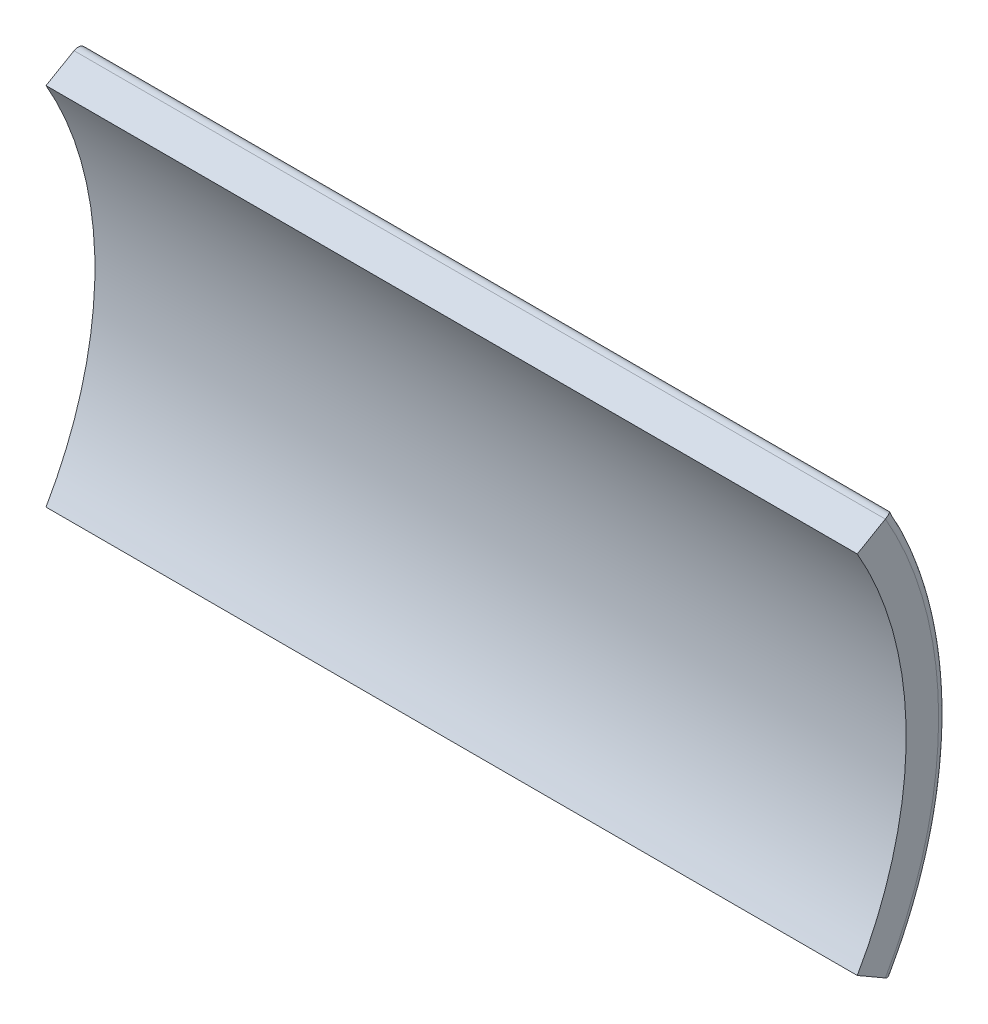
ISO-10303-21;
HEADER;
FILE_DESCRIPTION(('STEP AP214'),'2;1');
FILE_NAME('part.step','',(''),(''),'','','');
FILE_SCHEMA(('AUTOMOTIVE_DESIGN { 1 0 10303 214 1 1 1 1 }'));
ENDSEC;
DATA;
#1=APPLICATION_CONTEXT('core data for automotive mechanical design processes');
#2=APPLICATION_PROTOCOL_DEFINITION('international standard','automotive_design',2000,#1);
#3=PRODUCT_CONTEXT('',#1,'mechanical');
#4=PRODUCT('Part','Part','',(#3));
#5=PRODUCT_RELATED_PRODUCT_CATEGORY('part','',(#4));
#6=PRODUCT_DEFINITION_FORMATION('','',#4);
#7=PRODUCT_DEFINITION_CONTEXT('part definition',#1,'design');
#8=PRODUCT_DEFINITION('design','',#6,#7);
#9=PRODUCT_DEFINITION_SHAPE('','',#8);
#10=(LENGTH_UNIT() NAMED_UNIT(*) SI_UNIT(.MILLI.,.METRE.));
#11=(NAMED_UNIT(*) PLANE_ANGLE_UNIT() SI_UNIT($,.RADIAN.));
#12=(NAMED_UNIT(*) SI_UNIT($,.STERADIAN.) SOLID_ANGLE_UNIT());
#13=UNCERTAINTY_MEASURE_WITH_UNIT(LENGTH_MEASURE(1.E-05),#10,'distance_accuracy_value','');
#14=(GEOMETRIC_REPRESENTATION_CONTEXT(3) GLOBAL_UNCERTAINTY_ASSIGNED_CONTEXT((#13)) GLOBAL_UNIT_ASSIGNED_CONTEXT((#10,
#11,#12)) REPRESENTATION_CONTEXT('',''));
#15=CARTESIAN_POINT('',(0.,0.,0.));
#16=DIRECTION('',(0.,0.,1.));
#17=DIRECTION('',(1.,0.,0.));
#18=AXIS2_PLACEMENT_3D('',#15,#16,#17);
#19=CARTESIAN_POINT('',(10.,0.,0.));
#20=DIRECTION('',(-1.,0.,0.));
#21=DIRECTION('',(0.,0.,1.));
#22=AXIS2_PLACEMENT_3D('',#19,#20,#21);
#23=CYLINDRICAL_SURFACE('',#22,4.5);
#24=CARTESIAN_POINT('',(0.,0.,0.));
#25=DIRECTION('',(-1.,0.,0.));
#26=DIRECTION('',(0.,0.,1.));
#27=AXIS2_PLACEMENT_3D('',#24,#25,#26);
#28=CIRCLE('',#27,4.5);
#29=CARTESIAN_POINT('',(0.,2.25,-3.89711431702997));
#30=VERTEX_POINT('',#29);
#31=CARTESIAN_POINT('',(0.,-2.25,-3.89711431702997));
#32=VERTEX_POINT('',#31);
#33=EDGE_CURVE('E117',#30,#32,#28,.T.);
#34=ORIENTED_EDGE('',*,*,#33,.T.);
#35=DIRECTION('',(-1.,0.,0.));
#36=VECTOR('',#35,1.);
#37=CARTESIAN_POINT('',(10.,-2.25,-3.89711431702997));
#38=LINE('',#37,#36);
#39=CARTESIAN_POINT('',(10.,-2.25,-3.89711431702997));
#40=VERTEX_POINT('',#39);
#41=EDGE_CURVE('E102',#40,#32,#38,.T.);
#42=ORIENTED_EDGE('',*,*,#41,.F.);
#43=CARTESIAN_POINT('',(10.,0.,0.));
#44=DIRECTION('',(-1.,0.,0.));
#45=DIRECTION('',(0.,0.,1.));
#46=AXIS2_PLACEMENT_3D('',#43,#44,#45);
#47=CIRCLE('',#46,4.5);
#48=CARTESIAN_POINT('',(10.,2.25,-3.89711431702997));
#49=VERTEX_POINT('',#48);
#50=EDGE_CURVE('E110',#49,#40,#47,.T.);
#51=ORIENTED_EDGE('',*,*,#50,.F.);
#52=DIRECTION('',(-1.,0.,0.));
#53=VECTOR('',#52,1.);
#54=CARTESIAN_POINT('',(10.,2.25,-3.89711431702997));
#55=LINE('',#54,#53);
#56=EDGE_CURVE('E119',#49,#30,#55,.T.);
#57=ORIENTED_EDGE('',*,*,#56,.T.);
#58=EDGE_LOOP('',(#34,#42,#51,#57));
#59=FACE_BOUND('',#58,.T.);
#60=ADVANCED_FACE('F33',(#59),#23,.F.);
#61=CARTESIAN_POINT('',(10.,-2.5,-4.33012701892219));
#62=DIRECTION('',(0.,0.86602540378444,-0.499999999999997));
#63=DIRECTION('',(0.,0.499999999999997,0.86602540378444));
#64=AXIS2_PLACEMENT_3D('',#61,#62,#63);
#65=PLANE('',#64);
#66=DIRECTION('',(0.,-0.499999999999997,-0.86602540378444));
#67=VECTOR('',#66,1.);
#68=CARTESIAN_POINT('',(0.,-2.5,-4.33012701892219));
#69=LINE('',#68,#67);
#70=CARTESIAN_POINT('',(0.,-2.44948974278318,-4.24264068711929));
#71=VERTEX_POINT('',#70);
#72=EDGE_CURVE('E231',#32,#71,#69,.T.);
#73=ORIENTED_EDGE('',*,*,#72,.T.);
#74=DIRECTION('',(-1.,0.,0.));
#75=VECTOR('',#74,1.);
#76=CARTESIAN_POINT('',(10.,-2.44948974278318,-4.24264068711929));
#77=LINE('',#76,#75);
#78=CARTESIAN_POINT('',(10.,-2.44948974278318,-4.24264068711929));
#79=VERTEX_POINT('',#78);
#80=EDGE_CURVE('E105',#71,#79,#77,.F.);
#81=ORIENTED_EDGE('',*,*,#80,.T.);
#82=DIRECTION('',(0.,-0.499999999999997,-0.86602540378444));
#83=VECTOR('',#82,1.);
#84=CARTESIAN_POINT('',(10.,-2.5,-4.33012701892219));
#85=LINE('',#84,#83);
#86=EDGE_CURVE('E97',#40,#79,#85,.T.);
#87=ORIENTED_EDGE('',*,*,#86,.F.);
#88=ORIENTED_EDGE('',*,*,#41,.T.);
#89=EDGE_LOOP('',(#73,#81,#87,#88));
#90=FACE_BOUND('',#89,.T.);
#91=ADVANCED_FACE('F100',(#90),#65,.F.);
#92=CARTESIAN_POINT('',(10.,0.,0.));
#93=DIRECTION('',(-1.,0.,0.));
#94=DIRECTION('',(0.,0.,1.));
#95=AXIS2_PLACEMENT_3D('',#92,#93,#94);
#96=CYLINDRICAL_SURFACE('',#95,5.);
#97=CARTESIAN_POINT('',(9.9,0.,0.));
#98=DIRECTION('',(-1.,0.,0.));
#99=DIRECTION('',(0.,0.,1.));
#100=AXIS2_PLACEMENT_3D('',#97,#98,#99);
#101=CIRCLE('',#100,5.);
#102=CARTESIAN_POINT('',(9.9,2.41110939020891,-4.38024559910131));
#103=VERTEX_POINT('',#102);
#104=CARTESIAN_POINT('',(9.9,-2.41110939020891,-4.38024559910131));
#105=VERTEX_POINT('',#104);
#106=EDGE_CURVE('E118',#103,#105,#101,.T.);
#107=ORIENTED_EDGE('',*,*,#106,.T.);
#108=DIRECTION('',(-1.,0.,0.));
#109=VECTOR('',#108,1.);
#110=CARTESIAN_POINT('',(10.,-2.41110939020891,-4.38024559910131));
#111=LINE('',#110,#109);
#112=CARTESIAN_POINT('',(0.,-2.41110939020891,-4.38024559910131));
#113=VERTEX_POINT('',#112);
#114=EDGE_CURVE('E128',#105,#113,#111,.T.);
#115=ORIENTED_EDGE('',*,*,#114,.T.);
#116=CARTESIAN_POINT('',(0.,0.,0.));
#117=DIRECTION('',(1.,0.,0.));
#118=DIRECTION('',(0.,0.,1.));
#119=AXIS2_PLACEMENT_3D('',#116,#117,#118);
#120=CIRCLE('',#119,5.);
#121=CARTESIAN_POINT('',(0.,2.41110939020891,-4.38024559910131));
#122=VERTEX_POINT('',#121);
#123=EDGE_CURVE('E230',#113,#122,#120,.T.);
#124=ORIENTED_EDGE('',*,*,#123,.T.);
#125=DIRECTION('',(-1.,0.,0.));
#126=VECTOR('',#125,1.);
#127=CARTESIAN_POINT('',(10.,2.41110939020891,-4.38024559910131));
#128=LINE('',#127,#126);
#129=EDGE_CURVE('E121',#122,#103,#128,.F.);
#130=ORIENTED_EDGE('',*,*,#129,.T.);
#131=EDGE_LOOP('',(#107,#115,#124,#130));
#132=FACE_BOUND('',#131,.T.);
#133=ADVANCED_FACE('F156',(#132),#96,.T.);
#134=CARTESIAN_POINT('',(10.,2.25,-3.89711431702997));
#135=DIRECTION('',(0.,-0.86602540378444,-0.499999999999997));
#136=DIRECTION('',(0.,0.499999999999997,-0.86602540378444));
#137=AXIS2_PLACEMENT_3D('',#134,#135,#136);
#138=PLANE('',#137);
#139=DIRECTION('',(0.,-0.499999999999997,0.86602540378444));
#140=VECTOR('',#139,1.);
#141=CARTESIAN_POINT('',(10.,2.25,-3.89711431702997));
#142=LINE('',#141,#140);
#143=CARTESIAN_POINT('',(10.,2.44948974278318,-4.24264068711929));
#144=VERTEX_POINT('',#143);
#145=EDGE_CURVE('E54',#144,#49,#142,.T.);
#146=ORIENTED_EDGE('',*,*,#145,.F.);
#147=DIRECTION('',(-1.,0.,0.));
#148=VECTOR('',#147,1.);
#149=CARTESIAN_POINT('',(10.,2.44948974278318,-4.24264068711929));
#150=LINE('',#149,#148);
#151=CARTESIAN_POINT('',(0.,2.44948974278318,-4.24264068711929));
#152=VERTEX_POINT('',#151);
#153=EDGE_CURVE('E11',#144,#152,#150,.T.);
#154=ORIENTED_EDGE('',*,*,#153,.T.);
#155=DIRECTION('',(0.,-0.499999999999997,0.86602540378444));
#156=VECTOR('',#155,1.);
#157=CARTESIAN_POINT('',(0.,2.25,-3.89711431702997));
#158=LINE('',#157,#156);
#159=EDGE_CURVE('E114',#152,#30,#158,.T.);
#160=ORIENTED_EDGE('',*,*,#159,.T.);
#161=ORIENTED_EDGE('',*,*,#56,.F.);
#162=EDGE_LOOP('',(#146,#154,#160,#161));
#163=FACE_BOUND('',#162,.T.);
#164=ADVANCED_FACE('F161',(#163),#138,.F.);
#165=CARTESIAN_POINT('',(10.,0.,0.));
#166=DIRECTION('',(-1.,0.,0.));
#167=DIRECTION('',(0.,0.,1.));
#168=AXIS2_PLACEMENT_3D('',#165,#166,#167);
#169=PLANE('',#168);
#170=CARTESIAN_POINT('',(10.,-2.45,-4.24352447854375));
#171=VERTEX_POINT('',#170);
#172=EDGE_CURVE('E107',#79,#171,#85,.T.);
#173=ORIENTED_EDGE('',*,*,#172,.T.);
#174=CARTESIAN_POINT('',(10.,0.,0.));
#175=DIRECTION('',(-1.,0.,0.));
#176=DIRECTION('',(0.,0.,1.));
#177=AXIS2_PLACEMENT_3D('',#174,#175,#176);
#178=CIRCLE('',#177,4.9);
#179=CARTESIAN_POINT('',(10.,2.45,-4.24352447854375));
#180=VERTEX_POINT('',#179);
#181=EDGE_CURVE('E47',#171,#180,#178,.F.);
#182=ORIENTED_EDGE('',*,*,#181,.T.);
#183=EDGE_CURVE('E123',#180,#144,#142,.T.);
#184=ORIENTED_EDGE('',*,*,#183,.T.);
#185=ORIENTED_EDGE('',*,*,#145,.T.);
#186=ORIENTED_EDGE('',*,*,#50,.T.);
#187=ORIENTED_EDGE('',*,*,#86,.T.);
#188=EDGE_LOOP('',(#173,#182,#184,#185,#186,#187));
#189=FACE_BOUND('',#188,.T.);
#190=ADVANCED_FACE('F111',(#189),#169,.F.);
#191=CARTESIAN_POINT('',(0.,0.,0.));
#192=DIRECTION('',(-1.,0.,0.));
#193=DIRECTION('',(0.,0.,1.));
#194=AXIS2_PLACEMENT_3D('',#191,#192,#193);
#195=PLANE('',#194);
#196=ORIENTED_EDGE('',*,*,#123,.F.);
#197=CARTESIAN_POINT('',(0.,-2.36288720240473,-4.29264068711929));
#198=DIRECTION('',(-1.,0.,0.));
#199=DIRECTION('',(0.,0.,1.));
#200=AXIS2_PLACEMENT_3D('',#197,#198,#199);
#201=CIRCLE('',#200,0.1);
#202=EDGE_CURVE('E133',#113,#71,#201,.T.);
#203=ORIENTED_EDGE('',*,*,#202,.T.);
#204=ORIENTED_EDGE('',*,*,#72,.F.);
#205=ORIENTED_EDGE('',*,*,#33,.F.);
#206=ORIENTED_EDGE('',*,*,#159,.F.);
#207=CARTESIAN_POINT('',(0.,2.36288720240473,-4.29264068711929));
#208=DIRECTION('',(-1.,0.,0.));
#209=DIRECTION('',(0.,0.,1.));
#210=AXIS2_PLACEMENT_3D('',#207,#208,#209);
#211=CIRCLE('',#210,0.1);
#212=EDGE_CURVE('E131',#152,#122,#211,.T.);
#213=ORIENTED_EDGE('',*,*,#212,.T.);
#214=EDGE_LOOP('',(#196,#203,#204,#205,#206,#213));
#215=FACE_BOUND('',#214,.T.);
#216=ADVANCED_FACE('F165',(#215),#195,.T.);
#217=CARTESIAN_POINT('',(10.,2.36288720240473,-4.29264068711929));
#218=DIRECTION('',(-1.,0.,0.));
#219=DIRECTION('',(0.,0.,1.));
#220=AXIS2_PLACEMENT_3D('',#217,#218,#219);
#221=CYLINDRICAL_SURFACE('',#220,0.1);
#222=ORIENTED_EDGE('',*,*,#153,.F.);
#223=ORIENTED_EDGE('',*,*,#183,.F.);
#224=CARTESIAN_POINT('',(10.,2.4499954902717,-4.2435270822334));
#225=CARTESIAN_POINT('',(10.0000074455764,2.45221210836436,-4.24744311849737));
#226=CARTESIAN_POINT('',(9.99969681845466,2.45414570450147,-4.2515052675812));
#227=CARTESIAN_POINT('',(9.99850752198818,2.45742156899748,-4.25974220359465));
#228=CARTESIAN_POINT('',(9.99763382235561,2.45876883967113,-4.26391570175738));
#229=CARTESIAN_POINT('',(9.99538757003238,2.46088271752614,-4.27225712866285));
#230=CARTESIAN_POINT('',(9.99401643316156,2.46165095386035,-4.27642503984683));
#231=CARTESIAN_POINT('',(9.99085959853741,2.46265594946274,-4.28467272101214));
#232=CARTESIAN_POINT('',(9.98907295894086,2.46289148802702,-4.28875226737481));
#233=CARTESIAN_POINT('',(9.98437131204363,2.46288102550319,-4.29837776873468));
#234=CARTESIAN_POINT('',(9.98129320260158,2.4623996329472,-4.30384370920563));
#235=CARTESIAN_POINT('',(9.97467003909101,2.46064848673615,-4.31434787311919));
#236=CARTESIAN_POINT('',(9.97112411428723,2.45937724617116,-4.31938526943438));
#237=CARTESIAN_POINT('',(9.96230517890638,2.45558223030405,-4.33080110422044));
#238=CARTESIAN_POINT('',(9.95688526766997,2.45276685765502,-4.33696855365705));
#239=CARTESIAN_POINT('',(9.94567338949366,2.44617629748047,-4.34837572110463));
#240=CARTESIAN_POINT('',(9.93988100755976,2.44240002500593,-4.35361437899943));
#241=CARTESIAN_POINT('',(9.92866466605164,2.43448438083907,-4.36268666569065));
#242=CARTESIAN_POINT('',(9.92325989200165,2.43041637143119,-4.36660750640934));
#243=CARTESIAN_POINT('',(9.91237650835938,2.42175891168856,-4.37366682950113));
#244=CARTESIAN_POINT('',(9.90689806757617,2.41717051779685,-4.37680685704216));
#245=CARTESIAN_POINT('',(9.90094753694064,2.41194624806233,-4.37978102403023));
#246=CARTESIAN_POINT('',(9.90047374785319,2.41152862776736,-4.38001482379483));
#247=CARTESIAN_POINT('',(9.9,2.41110939020891,-4.38024559910131));
#248=B_SPLINE_CURVE_WITH_KNOTS('',3,(#224,#225,#226,#227,#228,#229,#230,#231,#232,#233,#234,
#235,#236,#237,#238,#239,#240,#241,#242,#243,#244,#245,#246,#247),.UNSPECIFIED.,.F.,.F.,(4,2,2,
2,2,2,2,2,2,2,2,4),(0.,0.0134596218320388,0.0268020455890039,0.0401067879294364,
0.0534419880011791,0.0722122999568425,0.091018055037208,0.116918183528997,0.142847686553062,
0.166247603007384,0.189600837602917,0.191621168986923),.UNSPECIFIED.);
#249=EDGE_CURVE('E38',#103,#180,#248,.F.);
#250=ORIENTED_EDGE('',*,*,#249,.F.);
#251=ORIENTED_EDGE('',*,*,#129,.F.);
#252=ORIENTED_EDGE('',*,*,#212,.F.);
#253=EDGE_LOOP('',(#222,#223,#250,#251,#252));
#254=FACE_BOUND('',#253,.T.);
#255=ADVANCED_FACE('F35',(#254),#221,.T.);
#256=CARTESIAN_POINT('',(9.9,0.,0.));
#257=DIRECTION('',(-1.,0.,0.));
#258=DIRECTION('',(0.,0.,1.));
#259=AXIS2_PLACEMENT_3D('',#256,#257,#258);
#260=TOROIDAL_SURFACE('',#259,4.9,0.1);
#261=ORIENTED_EDGE('',*,*,#249,.T.);
#262=ORIENTED_EDGE('',*,*,#181,.F.);
#263=CARTESIAN_POINT('',(10.,-2.4499954902717,-4.2435270822334));
#264=CARTESIAN_POINT('',(10.0000074455764,-2.45221210836436,-4.24744311849737));
#265=CARTESIAN_POINT('',(9.99969681845466,-2.45414570450147,-4.2515052675812));
#266=CARTESIAN_POINT('',(9.99850752198818,-2.45742156899748,-4.25974220359465));
#267=CARTESIAN_POINT('',(9.99763382235561,-2.45876883967113,-4.26391570175738));
#268=CARTESIAN_POINT('',(9.99538757003238,-2.46088271752614,-4.27225712866285));
#269=CARTESIAN_POINT('',(9.99401643316156,-2.46165095386035,-4.27642503984683));
#270=CARTESIAN_POINT('',(9.99085959853741,-2.46265594946275,-4.28467272101214));
#271=CARTESIAN_POINT('',(9.98907295894086,-2.46289148802702,-4.28875226737481));
#272=CARTESIAN_POINT('',(9.98437131204363,-2.46288102550319,-4.29837776873468));
#273=CARTESIAN_POINT('',(9.98129320260158,-2.4623996329472,-4.30384370920563));
#274=CARTESIAN_POINT('',(9.97467003909101,-2.46064848673615,-4.31434787311919));
#275=CARTESIAN_POINT('',(9.97112411428723,-2.45937724617116,-4.31938526943438));
#276=CARTESIAN_POINT('',(9.96230517890638,-2.45558223030405,-4.33080110422044));
#277=CARTESIAN_POINT('',(9.95688526766997,-2.45276685765502,-4.33696855365705));
#278=CARTESIAN_POINT('',(9.94567338949366,-2.44617629748047,-4.34837572110463));
#279=CARTESIAN_POINT('',(9.93988100755975,-2.44240002500594,-4.35361437899942));
#280=CARTESIAN_POINT('',(9.92866466605165,-2.43448438083906,-4.36268666569065));
#281=CARTESIAN_POINT('',(9.92325989200169,-2.43041637143116,-4.36660750640936));
#282=CARTESIAN_POINT('',(9.91237650835934,-2.4217589116886,-4.37366682950111));
#283=CARTESIAN_POINT('',(9.906898067576,-2.41717051779699,-4.37680685704208));
#284=CARTESIAN_POINT('',(9.90094753694061,-2.41194624806236,-4.37978102403022));
#285=CARTESIAN_POINT('',(9.90047374785317,-2.41152862776737,-4.38001482379483));
#286=CARTESIAN_POINT('',(9.9,-2.41110939020891,-4.38024559910131));
#287=B_SPLINE_CURVE_WITH_KNOTS('',3,(#263,#264,#265,#266,#267,#268,#269,#270,#271,#272,#273,
#274,#275,#276,#277,#278,#279,#280,#281,#282,#283,#284,#285,#286),.UNSPECIFIED.,.F.,.F.,(4,2,2,
2,2,2,2,2,2,2,2,4),(0.,0.0134596218320398,0.026802045589004,0.0401067879294343,
0.0534419880011793,0.0722122999568435,0.0910180550372082,0.116918183528998,0.142847686553062,
0.166247603007384,0.189600837602916,0.191621168986923),.UNSPECIFIED.);
#288=EDGE_CURVE('E136',#105,#171,#287,.F.);
#289=ORIENTED_EDGE('',*,*,#288,.F.);
#290=ORIENTED_EDGE('',*,*,#106,.F.);
#291=EDGE_LOOP('',(#261,#262,#289,#290));
#292=FACE_BOUND('',#291,.T.);
#293=ADVANCED_FACE('F141',(#292),#260,.T.);
#294=CARTESIAN_POINT('',(10.,-2.36288720240473,-4.29264068711929));
#295=DIRECTION('',(-1.,0.,0.));
#296=DIRECTION('',(0.,0.,1.));
#297=AXIS2_PLACEMENT_3D('',#294,#295,#296);
#298=CYLINDRICAL_SURFACE('',#297,0.1);
#299=ORIENTED_EDGE('',*,*,#172,.F.);
#300=ORIENTED_EDGE('',*,*,#80,.F.);
#301=ORIENTED_EDGE('',*,*,#202,.F.);
#302=ORIENTED_EDGE('',*,*,#114,.F.);
#303=ORIENTED_EDGE('',*,*,#288,.T.);
#304=EDGE_LOOP('',(#299,#300,#301,#302,#303));
#305=FACE_BOUND('',#304,.T.);
#306=ADVANCED_FACE('F144',(#305),#298,.T.);
#307=CLOSED_SHELL('',(#60,#91,#133,#164,#190,#216,#255,#293,#306));
#308=MANIFOLD_SOLID_BREP('B2',#307);
#309=ADVANCED_BREP_SHAPE_REPRESENTATION('',(#18,#308),#14);
#310=SHAPE_DEFINITION_REPRESENTATION(#9,#309);
ENDSEC;
END-ISO-10303-21;
